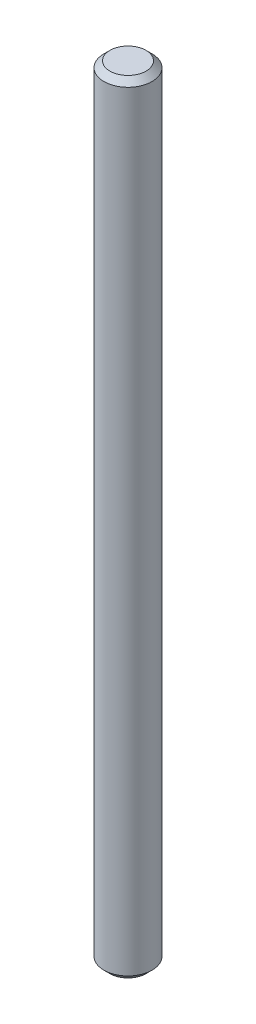
ISO-10303-21;
HEADER;
FILE_DESCRIPTION(('STEP AP214'),'2;1');
FILE_NAME('part.step','',(''),(''),'','','');
FILE_SCHEMA(('AUTOMOTIVE_DESIGN { 1 0 10303 214 1 1 1 1 }'));
ENDSEC;
DATA;
#1=APPLICATION_CONTEXT('core data for automotive mechanical design processes');
#2=APPLICATION_PROTOCOL_DEFINITION('international standard','automotive_design',2000,#1);
#3=PRODUCT_CONTEXT('',#1,'mechanical');
#4=PRODUCT('Part','Part','',(#3));
#5=PRODUCT_RELATED_PRODUCT_CATEGORY('part','',(#4));
#6=PRODUCT_DEFINITION_FORMATION('','',#4);
#7=PRODUCT_DEFINITION_CONTEXT('part definition',#1,'design');
#8=PRODUCT_DEFINITION('design','',#6,#7);
#9=PRODUCT_DEFINITION_SHAPE('','',#8);
#10=(LENGTH_UNIT() NAMED_UNIT(*) SI_UNIT(.MILLI.,.METRE.));
#11=(NAMED_UNIT(*) PLANE_ANGLE_UNIT() SI_UNIT($,.RADIAN.));
#12=(NAMED_UNIT(*) SI_UNIT($,.STERADIAN.) SOLID_ANGLE_UNIT());
#13=UNCERTAINTY_MEASURE_WITH_UNIT(LENGTH_MEASURE(1.E-05),#10,'distance_accuracy_value','');
#14=(GEOMETRIC_REPRESENTATION_CONTEXT(3) GLOBAL_UNCERTAINTY_ASSIGNED_CONTEXT((#13)) GLOBAL_UNIT_ASSIGNED_CONTEXT((#10,
#11,#12)) REPRESENTATION_CONTEXT('',''));
#15=CARTESIAN_POINT('',(0.,0.,0.));
#16=DIRECTION('',(0.,0.,1.));
#17=DIRECTION('',(1.,0.,0.));
#18=AXIS2_PLACEMENT_3D('',#15,#16,#17);
#19=CARTESIAN_POINT('',(0.,65.,0.));
#20=DIRECTION('',(0.,-1.,0.));
#21=DIRECTION('',(0.,0.,-1.));
#22=AXIS2_PLACEMENT_3D('',#19,#20,#21);
#23=CYLINDRICAL_SURFACE('',#22,4.);
#24=CARTESIAN_POINT('',(0.,64.,0.));
#25=DIRECTION('',(0.,1.,0.));
#26=DIRECTION('',(0.,0.,1.));
#27=AXIS2_PLACEMENT_3D('',#24,#25,#26);
#28=CIRCLE('',#27,4.);
#29=CARTESIAN_POINT('',(0.,64.,4.));
#30=VERTEX_POINT('',#29);
#31=EDGE_CURVE('E39',#30,#30,#28,.F.);
#32=ORIENTED_EDGE('',*,*,#31,.T.);
#33=EDGE_LOOP('',(#32));
#34=FACE_BOUND('',#33,.T.);
#35=CARTESIAN_POINT('',(0.,-64.,0.));
#36=DIRECTION('',(0.,1.,0.));
#37=DIRECTION('',(0.,0.,1.));
#38=AXIS2_PLACEMENT_3D('',#35,#36,#37);
#39=CIRCLE('',#38,4.);
#40=CARTESIAN_POINT('',(0.,-64.,4.));
#41=VERTEX_POINT('',#40);
#42=EDGE_CURVE('E43',#41,#41,#39,.T.);
#43=ORIENTED_EDGE('',*,*,#42,.T.);
#44=EDGE_LOOP('',(#43));
#45=FACE_BOUND('',#44,.T.);
#46=ADVANCED_FACE('F32',(#34,#45),#23,.T.);
#47=CARTESIAN_POINT('',(0.,65.,0.));
#48=DIRECTION('',(0.,1.,0.));
#49=DIRECTION('',(0.,0.,1.));
#50=AXIS2_PLACEMENT_3D('',#47,#48,#49);
#51=PLANE('',#50);
#52=CARTESIAN_POINT('',(0.,65.,0.));
#53=DIRECTION('',(0.,1.,0.));
#54=DIRECTION('',(0.,0.,1.));
#55=AXIS2_PLACEMENT_3D('',#52,#53,#54);
#56=CIRCLE('',#55,2.99999999999996);
#57=CARTESIAN_POINT('',(0.,65.,2.99999999999996));
#58=VERTEX_POINT('',#57);
#59=EDGE_CURVE('E47',#58,#58,#56,.T.);
#60=ORIENTED_EDGE('',*,*,#59,.T.);
#61=EDGE_LOOP('',(#60));
#62=FACE_BOUND('',#61,.T.);
#63=ADVANCED_FACE('F53',(#62),#51,.T.);
#64=CARTESIAN_POINT('',(0.,-65.,0.));
#65=DIRECTION('',(0.,1.,0.));
#66=DIRECTION('',(0.,0.,1.));
#67=AXIS2_PLACEMENT_3D('',#64,#65,#66);
#68=PLANE('',#67);
#69=CARTESIAN_POINT('',(0.,-65.,0.));
#70=DIRECTION('',(0.,1.,0.));
#71=DIRECTION('',(0.,0.,1.));
#72=AXIS2_PLACEMENT_3D('',#69,#70,#71);
#73=CIRCLE('',#72,3.00000000000002);
#74=CARTESIAN_POINT('',(0.,-65.,3.00000000000002));
#75=VERTEX_POINT('',#74);
#76=EDGE_CURVE('E10',#75,#75,#73,.F.);
#77=ORIENTED_EDGE('',*,*,#76,.T.);
#78=EDGE_LOOP('',(#77));
#79=FACE_BOUND('',#78,.T.);
#80=ADVANCED_FACE('F57',(#79),#68,.F.);
#81=CARTESIAN_POINT('',(0.,65.,0.));
#82=DIRECTION('',(0.,-1.,0.));
#83=DIRECTION('',(0.,0.,-1.));
#84=AXIS2_PLACEMENT_3D('',#81,#82,#83);
#85=CONICAL_SURFACE('',#84,2.99999999999996,0.785398163397447);
#86=ORIENTED_EDGE('',*,*,#31,.F.);
#87=EDGE_LOOP('',(#86));
#88=FACE_BOUND('',#87,.T.);
#89=ORIENTED_EDGE('',*,*,#59,.F.);
#90=EDGE_LOOP('',(#89));
#91=FACE_BOUND('',#90,.T.);
#92=ADVANCED_FACE('F55',(#88,#91),#85,.T.);
#93=CARTESIAN_POINT('',(0.,-64.,0.));
#94=DIRECTION('',(0.,1.,0.));
#95=DIRECTION('',(0.,0.,1.));
#96=AXIS2_PLACEMENT_3D('',#93,#94,#95);
#97=CONICAL_SURFACE('',#96,4.,0.78539816339744);
#98=ORIENTED_EDGE('',*,*,#76,.F.);
#99=EDGE_LOOP('',(#98));
#100=FACE_BOUND('',#99,.T.);
#101=ORIENTED_EDGE('',*,*,#42,.F.);
#102=EDGE_LOOP('',(#101));
#103=FACE_BOUND('',#102,.T.);
#104=ADVANCED_FACE('F34',(#100,#103),#97,.T.);
#105=CLOSED_SHELL('',(#46,#63,#80,#92,#104));
#106=MANIFOLD_SOLID_BREP('B2',#105);
#107=ADVANCED_BREP_SHAPE_REPRESENTATION('',(#18,#106),#14);
#108=SHAPE_DEFINITION_REPRESENTATION(#9,#107);
ENDSEC;
END-ISO-10303-21;
